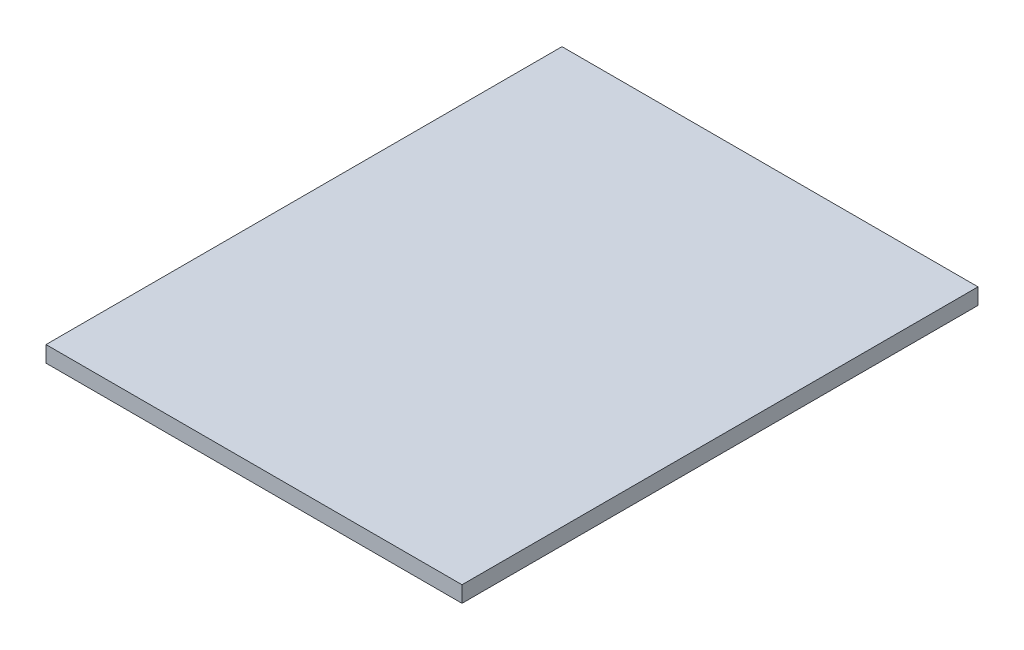
ISO-10303-21;
HEADER;
FILE_DESCRIPTION(('STEP AP214'),'2;1');
FILE_NAME('part.step','',(''),(''),'','','');
FILE_SCHEMA(('AUTOMOTIVE_DESIGN { 1 0 10303 214 1 1 1 1 }'));
ENDSEC;
DATA;
#1=APPLICATION_CONTEXT('core data for automotive mechanical design processes');
#2=APPLICATION_PROTOCOL_DEFINITION('international standard','automotive_design',2000,#1);
#3=PRODUCT_CONTEXT('',#1,'mechanical');
#4=PRODUCT('Part','Part','',(#3));
#5=PRODUCT_RELATED_PRODUCT_CATEGORY('part','',(#4));
#6=PRODUCT_DEFINITION_FORMATION('','',#4);
#7=PRODUCT_DEFINITION_CONTEXT('part definition',#1,'design');
#8=PRODUCT_DEFINITION('design','',#6,#7);
#9=PRODUCT_DEFINITION_SHAPE('','',#8);
#10=(LENGTH_UNIT() NAMED_UNIT(*) SI_UNIT(.MILLI.,.METRE.));
#11=(NAMED_UNIT(*) PLANE_ANGLE_UNIT() SI_UNIT($,.RADIAN.));
#12=(NAMED_UNIT(*) SI_UNIT($,.STERADIAN.) SOLID_ANGLE_UNIT());
#13=UNCERTAINTY_MEASURE_WITH_UNIT(LENGTH_MEASURE(1.E-05),#10,'distance_accuracy_value','');
#14=(GEOMETRIC_REPRESENTATION_CONTEXT(3) GLOBAL_UNCERTAINTY_ASSIGNED_CONTEXT((#13)) GLOBAL_UNIT_ASSIGNED_CONTEXT((#10,
#11,#12)) REPRESENTATION_CONTEXT('',''));
#15=CARTESIAN_POINT('',(0.,0.,0.));
#16=DIRECTION('',(0.,0.,1.));
#17=DIRECTION('',(1.,0.,0.));
#18=AXIS2_PLACEMENT_3D('',#15,#16,#17);
#19=CARTESIAN_POINT('',(-163.83,12.7,203.2));
#20=DIRECTION('',(-1.,0.,0.));
#21=DIRECTION('',(0.,0.,1.));
#22=AXIS2_PLACEMENT_3D('',#19,#20,#21);
#23=PLANE('',#22);
#24=DIRECTION('',(0.,0.,-1.));
#25=VECTOR('',#24,1.);
#26=CARTESIAN_POINT('',(-163.83,0.,203.2));
#27=LINE('',#26,#25);
#28=CARTESIAN_POINT('',(-163.83,0.,203.2));
#29=VERTEX_POINT('',#28);
#30=CARTESIAN_POINT('',(-163.83,0.,-203.2));
#31=VERTEX_POINT('',#30);
#32=EDGE_CURVE('E114',#29,#31,#27,.T.);
#33=ORIENTED_EDGE('',*,*,#32,.F.);
#34=DIRECTION('',(0.,-1.,0.));
#35=VECTOR('',#34,1.);
#36=CARTESIAN_POINT('',(-163.83,12.7,203.2));
#37=LINE('',#36,#35);
#38=CARTESIAN_POINT('',(-163.83,12.7,203.2));
#39=VERTEX_POINT('',#38);
#40=EDGE_CURVE('E11',#39,#29,#37,.T.);
#41=ORIENTED_EDGE('',*,*,#40,.F.);
#42=DIRECTION('',(0.,0.,-1.));
#43=VECTOR('',#42,1.);
#44=CARTESIAN_POINT('',(-163.83,12.7,203.2));
#45=LINE('',#44,#43);
#46=CARTESIAN_POINT('',(-163.83,12.7,-203.2));
#47=VERTEX_POINT('',#46);
#48=EDGE_CURVE('E107',#39,#47,#45,.T.);
#49=ORIENTED_EDGE('',*,*,#48,.T.);
#50=DIRECTION('',(0.,-1.,0.));
#51=VECTOR('',#50,1.);
#52=CARTESIAN_POINT('',(-163.83,12.7,-203.2));
#53=LINE('',#52,#51);
#54=EDGE_CURVE('E46',#47,#31,#53,.T.);
#55=ORIENTED_EDGE('',*,*,#54,.T.);
#56=EDGE_LOOP('',(#33,#41,#49,#55));
#57=FACE_BOUND('',#56,.T.);
#58=ADVANCED_FACE('F43',(#57),#23,.T.);
#59=CARTESIAN_POINT('',(-163.83,12.7,203.2));
#60=DIRECTION('',(0.,0.,-1.));
#61=DIRECTION('',(-1.,0.,0.));
#62=AXIS2_PLACEMENT_3D('',#59,#60,#61);
#63=PLANE('',#62);
#64=DIRECTION('',(1.,0.,0.));
#65=VECTOR('',#64,1.);
#66=CARTESIAN_POINT('',(-163.83,0.,203.2));
#67=LINE('',#66,#65);
#68=CARTESIAN_POINT('',(163.83,0.,203.2));
#69=VERTEX_POINT('',#68);
#70=EDGE_CURVE('E77',#29,#69,#67,.T.);
#71=ORIENTED_EDGE('',*,*,#70,.T.);
#72=DIRECTION('',(0.,-1.,0.));
#73=VECTOR('',#72,1.);
#74=CARTESIAN_POINT('',(163.83,12.7,203.2));
#75=LINE('',#74,#73);
#76=CARTESIAN_POINT('',(163.83,12.7,203.2));
#77=VERTEX_POINT('',#76);
#78=EDGE_CURVE('E53',#77,#69,#75,.T.);
#79=ORIENTED_EDGE('',*,*,#78,.F.);
#80=DIRECTION('',(1.,0.,0.));
#81=VECTOR('',#80,1.);
#82=CARTESIAN_POINT('',(-163.83,12.7,203.2));
#83=LINE('',#82,#81);
#84=EDGE_CURVE('E94',#39,#77,#83,.T.);
#85=ORIENTED_EDGE('',*,*,#84,.F.);
#86=ORIENTED_EDGE('',*,*,#40,.T.);
#87=EDGE_LOOP('',(#71,#79,#85,#86));
#88=FACE_BOUND('',#87,.T.);
#89=ADVANCED_FACE('F130',(#88),#63,.F.);
#90=CARTESIAN_POINT('',(163.83,12.7,203.2));
#91=DIRECTION('',(-1.,0.,0.));
#92=DIRECTION('',(0.,0.,1.));
#93=AXIS2_PLACEMENT_3D('',#90,#91,#92);
#94=PLANE('',#93);
#95=DIRECTION('',(0.,0.,-1.));
#96=VECTOR('',#95,1.);
#97=CARTESIAN_POINT('',(163.83,0.,203.2));
#98=LINE('',#97,#96);
#99=CARTESIAN_POINT('',(163.83,0.,-203.2));
#100=VERTEX_POINT('',#99);
#101=EDGE_CURVE('E102',#69,#100,#98,.T.);
#102=ORIENTED_EDGE('',*,*,#101,.T.);
#103=DIRECTION('',(0.,-1.,0.));
#104=VECTOR('',#103,1.);
#105=CARTESIAN_POINT('',(163.83,12.7,-203.2));
#106=LINE('',#105,#104);
#107=CARTESIAN_POINT('',(163.83,12.7,-203.2));
#108=VERTEX_POINT('',#107);
#109=EDGE_CURVE('E99',#108,#100,#106,.T.);
#110=ORIENTED_EDGE('',*,*,#109,.F.);
#111=DIRECTION('',(0.,0.,-1.));
#112=VECTOR('',#111,1.);
#113=CARTESIAN_POINT('',(163.83,12.7,203.2));
#114=LINE('',#113,#112);
#115=EDGE_CURVE('E89',#77,#108,#114,.T.);
#116=ORIENTED_EDGE('',*,*,#115,.F.);
#117=ORIENTED_EDGE('',*,*,#78,.T.);
#118=EDGE_LOOP('',(#102,#110,#116,#117));
#119=FACE_BOUND('',#118,.T.);
#120=ADVANCED_FACE('F100',(#119),#94,.F.);
#121=CARTESIAN_POINT('',(-163.83,12.7,-203.2));
#122=DIRECTION('',(0.,0.,-1.));
#123=DIRECTION('',(-1.,0.,0.));
#124=AXIS2_PLACEMENT_3D('',#121,#122,#123);
#125=PLANE('',#124);
#126=DIRECTION('',(1.,0.,0.));
#127=VECTOR('',#126,1.);
#128=CARTESIAN_POINT('',(-163.83,0.,-203.2));
#129=LINE('',#128,#127);
#130=EDGE_CURVE('E118',#31,#100,#129,.T.);
#131=ORIENTED_EDGE('',*,*,#130,.F.);
#132=ORIENTED_EDGE('',*,*,#54,.F.);
#133=DIRECTION('',(1.,0.,0.));
#134=VECTOR('',#133,1.);
#135=CARTESIAN_POINT('',(-163.83,12.7,-203.2));
#136=LINE('',#135,#134);
#137=EDGE_CURVE('E93',#47,#108,#136,.T.);
#138=ORIENTED_EDGE('',*,*,#137,.T.);
#139=ORIENTED_EDGE('',*,*,#109,.T.);
#140=EDGE_LOOP('',(#131,#132,#138,#139));
#141=FACE_BOUND('',#140,.T.);
#142=ADVANCED_FACE('F105',(#141),#125,.T.);
#143=CARTESIAN_POINT('',(0.,12.7,0.));
#144=DIRECTION('',(0.,-1.,0.));
#145=DIRECTION('',(0.,0.,-1.));
#146=AXIS2_PLACEMENT_3D('',#143,#144,#145);
#147=PLANE('',#146);
#148=ORIENTED_EDGE('',*,*,#48,.F.);
#149=ORIENTED_EDGE('',*,*,#84,.T.);
#150=ORIENTED_EDGE('',*,*,#115,.T.);
#151=ORIENTED_EDGE('',*,*,#137,.F.);
#152=EDGE_LOOP('',(#148,#149,#150,#151));
#153=FACE_BOUND('',#152,.T.);
#154=ADVANCED_FACE('F92',(#153),#147,.F.);
#155=CARTESIAN_POINT('',(0.,0.,0.));
#156=DIRECTION('',(0.,-1.,0.));
#157=DIRECTION('',(0.,0.,-1.));
#158=AXIS2_PLACEMENT_3D('',#155,#156,#157);
#159=PLANE('',#158);
#160=ORIENTED_EDGE('',*,*,#32,.T.);
#161=ORIENTED_EDGE('',*,*,#130,.T.);
#162=ORIENTED_EDGE('',*,*,#101,.F.);
#163=ORIENTED_EDGE('',*,*,#70,.F.);
#164=EDGE_LOOP('',(#160,#161,#162,#163));
#165=FACE_BOUND('',#164,.T.);
#166=ADVANCED_FACE('F127',(#165),#159,.T.);
#167=CLOSED_SHELL('',(#58,#89,#120,#142,#154,#166));
#168=MANIFOLD_SOLID_BREP('B2',#167);
#169=ADVANCED_BREP_SHAPE_REPRESENTATION('',(#18,#168),#14);
#170=SHAPE_DEFINITION_REPRESENTATION(#9,#169);
ENDSEC;
END-ISO-10303-21;
